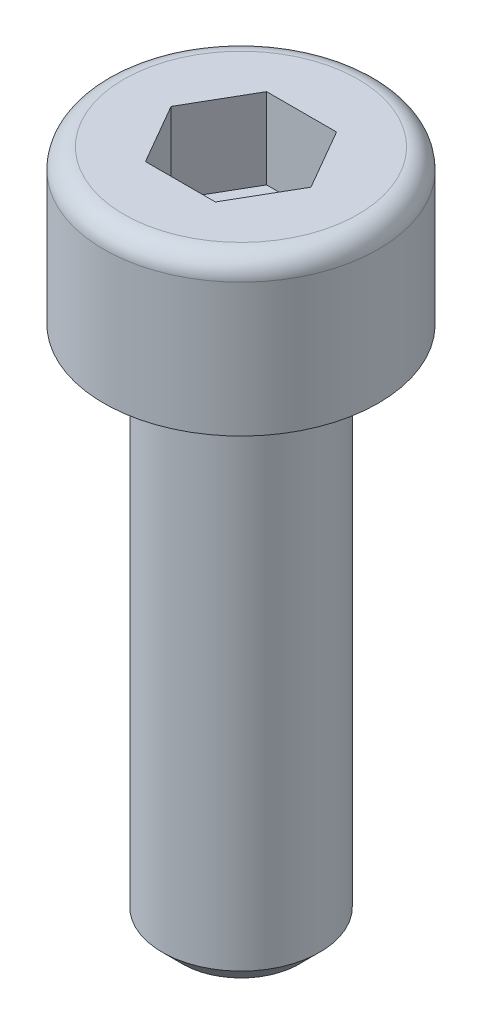
ISO-10303-21;
HEADER;
FILE_DESCRIPTION(('STEP AP214'),'2;1');
FILE_NAME('part.step','',(''),(''),'','','');
FILE_SCHEMA(('AUTOMOTIVE_DESIGN { 1 0 10303 214 1 1 1 1 }'));
ENDSEC;
DATA;
#1=APPLICATION_CONTEXT('core data for automotive mechanical design processes');
#2=APPLICATION_PROTOCOL_DEFINITION('international standard','automotive_design',2000,#1);
#3=PRODUCT_CONTEXT('',#1,'mechanical');
#4=PRODUCT('Part','Part','',(#3));
#5=PRODUCT_RELATED_PRODUCT_CATEGORY('part','',(#4));
#6=PRODUCT_DEFINITION_FORMATION('','',#4);
#7=PRODUCT_DEFINITION_CONTEXT('part definition',#1,'design');
#8=PRODUCT_DEFINITION('design','',#6,#7);
#9=PRODUCT_DEFINITION_SHAPE('','',#8);
#10=(LENGTH_UNIT() NAMED_UNIT(*) SI_UNIT(.MILLI.,.METRE.));
#11=(NAMED_UNIT(*) PLANE_ANGLE_UNIT() SI_UNIT($,.RADIAN.));
#12=(NAMED_UNIT(*) SI_UNIT($,.STERADIAN.) SOLID_ANGLE_UNIT());
#13=UNCERTAINTY_MEASURE_WITH_UNIT(LENGTH_MEASURE(1.E-05),#10,'distance_accuracy_value','');
#14=(GEOMETRIC_REPRESENTATION_CONTEXT(3) GLOBAL_UNCERTAINTY_ASSIGNED_CONTEXT((#13)) GLOBAL_UNIT_ASSIGNED_CONTEXT((#10,
#11,#12)) REPRESENTATION_CONTEXT('',''));
#15=CARTESIAN_POINT('',(0.,0.,0.));
#16=DIRECTION('',(0.,0.,1.));
#17=DIRECTION('',(1.,0.,0.));
#18=AXIS2_PLACEMENT_3D('',#15,#16,#17);
#19=CARTESIAN_POINT('',(0.,3.8,0.));
#20=DIRECTION('',(0.,1.,0.));
#21=DIRECTION('',(-1.,0.,0.));
#22=AXIS2_PLACEMENT_3D('',#19,#20,#21);
#23=PLANE('',#22);
#24=DIRECTION('',(0.5,0.,-0.866025403784439));
#25=VECTOR('',#24,1.);
#26=CARTESIAN_POINT('',(0.866025403784438,3.8,1.5));
#27=LINE('',#26,#25);
#28=CARTESIAN_POINT('',(0.866025403784438,3.8,1.5));
#29=VERTEX_POINT('',#28);
#30=CARTESIAN_POINT('',(1.73205080756888,3.8,0.));
#31=VERTEX_POINT('',#30);
#32=EDGE_CURVE('E44',#29,#31,#27,.T.);
#33=ORIENTED_EDGE('',*,*,#32,.F.);
#34=DIRECTION('',(1.,0.,0.));
#35=VECTOR('',#34,1.);
#36=CARTESIAN_POINT('',(-0.86602540378444,3.8,1.5));
#37=LINE('',#36,#35);
#38=CARTESIAN_POINT('',(-0.86602540378444,3.8,1.5));
#39=VERTEX_POINT('',#38);
#40=EDGE_CURVE('E127',#39,#29,#37,.T.);
#41=ORIENTED_EDGE('',*,*,#40,.F.);
#42=DIRECTION('',(0.5,0.,0.866025403784439));
#43=VECTOR('',#42,1.);
#44=CARTESIAN_POINT('',(-1.73205080756888,3.8,0.));
#45=LINE('',#44,#43);
#46=CARTESIAN_POINT('',(-1.73205080756888,3.8,0.));
#47=VERTEX_POINT('',#46);
#48=EDGE_CURVE('E125',#47,#39,#45,.T.);
#49=ORIENTED_EDGE('',*,*,#48,.F.);
#50=DIRECTION('',(-0.5,0.,0.866025403784439));
#51=VECTOR('',#50,1.);
#52=CARTESIAN_POINT('',(-0.866025403784439,3.8,-1.5));
#53=LINE('',#52,#51);
#54=CARTESIAN_POINT('',(-0.866025403784439,3.8,-1.5));
#55=VERTEX_POINT('',#54);
#56=EDGE_CURVE('E92',#55,#47,#53,.T.);
#57=ORIENTED_EDGE('',*,*,#56,.F.);
#58=DIRECTION('',(-1.,0.,0.));
#59=VECTOR('',#58,1.);
#60=CARTESIAN_POINT('',(0.866025403784439,3.8,-1.5));
#61=LINE('',#60,#59);
#62=CARTESIAN_POINT('',(0.866025403784439,3.8,-1.5));
#63=VERTEX_POINT('',#62);
#64=EDGE_CURVE('E121',#63,#55,#61,.T.);
#65=ORIENTED_EDGE('',*,*,#64,.F.);
#66=DIRECTION('',(-0.5,0.,-0.866025403784439));
#67=VECTOR('',#66,1.);
#68=CARTESIAN_POINT('',(1.73205080756888,3.8,0.));
#69=LINE('',#68,#67);
#70=EDGE_CURVE('E118',#31,#63,#69,.T.);
#71=ORIENTED_EDGE('',*,*,#70,.F.);
#72=EDGE_LOOP('',(#33,#41,#49,#57,#65,#71));
#73=FACE_BOUND('',#72,.T.);
#74=CARTESIAN_POINT('',(0.,3.8,0.));
#75=DIRECTION('',(0.,1.,0.));
#76=DIRECTION('',(-1.,0.,0.));
#77=AXIS2_PLACEMENT_3D('',#74,#75,#76);
#78=CIRCLE('',#77,2.9);
#79=CARTESIAN_POINT('',(-2.9,3.8,0.));
#80=VERTEX_POINT('',#79);
#81=EDGE_CURVE('E11',#80,#80,#78,.T.);
#82=ORIENTED_EDGE('',*,*,#81,.T.);
#83=EDGE_LOOP('',(#82));
#84=FACE_BOUND('',#83,.T.);
#85=ADVANCED_FACE('F30',(#73,#84),#23,.T.);
#86=CARTESIAN_POINT('',(0.,3.3,0.));
#87=DIRECTION('',(0.,1.,0.));
#88=DIRECTION('',(-1.,0.,0.));
#89=AXIS2_PLACEMENT_3D('',#86,#87,#88);
#90=TOROIDAL_SURFACE('',#89,2.9,0.5);
#91=CARTESIAN_POINT('',(0.,3.3,0.));
#92=DIRECTION('',(0.,1.,0.));
#93=DIRECTION('',(-1.,0.,0.));
#94=AXIS2_PLACEMENT_3D('',#91,#92,#93);
#95=CIRCLE('',#94,3.4);
#96=CARTESIAN_POINT('',(-3.4,3.3,0.));
#97=VERTEX_POINT('',#96);
#98=EDGE_CURVE('E37',#97,#97,#95,.T.);
#99=ORIENTED_EDGE('',*,*,#98,.T.);
#100=EDGE_LOOP('',(#99));
#101=FACE_BOUND('',#100,.T.);
#102=ORIENTED_EDGE('',*,*,#81,.F.);
#103=EDGE_LOOP('',(#102));
#104=FACE_BOUND('',#103,.T.);
#105=ADVANCED_FACE('F150',(#101,#104),#90,.T.);
#106=CARTESIAN_POINT('',(0.,3.8,0.));
#107=DIRECTION('',(0.,1.,0.));
#108=DIRECTION('',(-1.,0.,0.));
#109=AXIS2_PLACEMENT_3D('',#106,#107,#108);
#110=CYLINDRICAL_SURFACE('',#109,3.4);
#111=CARTESIAN_POINT('',(0.,0.,0.));
#112=DIRECTION('',(0.,1.,0.));
#113=DIRECTION('',(-1.,0.,0.));
#114=AXIS2_PLACEMENT_3D('',#111,#112,#113);
#115=CIRCLE('',#114,3.4);
#116=CARTESIAN_POINT('',(-3.4,0.,0.));
#117=VERTEX_POINT('',#116);
#118=EDGE_CURVE('E145',#117,#117,#115,.T.);
#119=ORIENTED_EDGE('',*,*,#118,.T.);
#120=EDGE_LOOP('',(#119));
#121=FACE_BOUND('',#120,.T.);
#122=ORIENTED_EDGE('',*,*,#98,.F.);
#123=EDGE_LOOP('',(#122));
#124=FACE_BOUND('',#123,.T.);
#125=ADVANCED_FACE('F153',(#121,#124),#110,.T.);
#126=CARTESIAN_POINT('',(-3.4,0.,0.));
#127=DIRECTION('',(0.,-1.,0.));
#128=DIRECTION('',(1.,0.,0.));
#129=AXIS2_PLACEMENT_3D('',#126,#127,#128);
#130=PLANE('',#129);
#131=CARTESIAN_POINT('',(0.,0.,0.));
#132=DIRECTION('',(0.,1.,0.));
#133=DIRECTION('',(-1.,0.,0.));
#134=AXIS2_PLACEMENT_3D('',#131,#132,#133);
#135=CIRCLE('',#134,1.95);
#136=CARTESIAN_POINT('',(-1.95,0.,0.));
#137=VERTEX_POINT('',#136);
#138=EDGE_CURVE('E142',#137,#137,#135,.T.);
#139=ORIENTED_EDGE('',*,*,#138,.T.);
#140=EDGE_LOOP('',(#139));
#141=FACE_BOUND('',#140,.T.);
#142=ORIENTED_EDGE('',*,*,#118,.F.);
#143=EDGE_LOOP('',(#142));
#144=FACE_BOUND('',#143,.T.);
#145=ADVANCED_FACE('F155',(#141,#144),#130,.T.);
#146=CARTESIAN_POINT('',(0.,3.8,0.));
#147=DIRECTION('',(0.,1.,0.));
#148=DIRECTION('',(-1.,0.,0.));
#149=AXIS2_PLACEMENT_3D('',#146,#147,#148);
#150=CYLINDRICAL_SURFACE('',#149,1.95);
#151=CARTESIAN_POINT('',(0.,-12.5,0.));
#152=DIRECTION('',(0.,1.,0.));
#153=DIRECTION('',(-1.,0.,0.));
#154=AXIS2_PLACEMENT_3D('',#151,#152,#153);
#155=CIRCLE('',#154,1.95);
#156=CARTESIAN_POINT('',(-1.95,-12.5,0.));
#157=VERTEX_POINT('',#156);
#158=EDGE_CURVE('E139',#157,#157,#155,.T.);
#159=ORIENTED_EDGE('',*,*,#158,.T.);
#160=EDGE_LOOP('',(#159));
#161=FACE_BOUND('',#160,.T.);
#162=ORIENTED_EDGE('',*,*,#138,.F.);
#163=EDGE_LOOP('',(#162));
#164=FACE_BOUND('',#163,.T.);
#165=ADVANCED_FACE('F162',(#161,#164),#150,.T.);
#166=CARTESIAN_POINT('',(0.,-12.5,0.));
#167=DIRECTION('',(0.,1.,0.));
#168=DIRECTION('',(-1.,0.,0.));
#169=AXIS2_PLACEMENT_3D('',#166,#167,#168);
#170=CONICAL_SURFACE('',#169,1.95,0.785398163397448);
#171=CARTESIAN_POINT('',(0.,-13.,0.));
#172=DIRECTION('',(0.,1.,0.));
#173=DIRECTION('',(-1.,0.,0.));
#174=AXIS2_PLACEMENT_3D('',#171,#172,#173);
#175=CIRCLE('',#174,1.45);
#176=CARTESIAN_POINT('',(-1.45,-13.,0.));
#177=VERTEX_POINT('',#176);
#178=EDGE_CURVE('E131',#177,#177,#175,.T.);
#179=ORIENTED_EDGE('',*,*,#178,.T.);
#180=EDGE_LOOP('',(#179));
#181=FACE_BOUND('',#180,.T.);
#182=ORIENTED_EDGE('',*,*,#158,.F.);
#183=EDGE_LOOP('',(#182));
#184=FACE_BOUND('',#183,.T.);
#185=ADVANCED_FACE('F187',(#181,#184),#170,.T.);
#186=CARTESIAN_POINT('',(-1.45,-13.,0.));
#187=DIRECTION('',(0.,-1.,0.));
#188=DIRECTION('',(1.,0.,0.));
#189=AXIS2_PLACEMENT_3D('',#186,#187,#188);
#190=PLANE('',#189);
#191=ORIENTED_EDGE('',*,*,#178,.F.);
#192=EDGE_LOOP('',(#191));
#193=FACE_BOUND('',#192,.T.);
#194=ADVANCED_FACE('F180',(#193),#190,.T.);
#195=CARTESIAN_POINT('',(0.866025403784438,1.8,1.5));
#196=DIRECTION('',(0.866025403784439,0.,0.5));
#197=DIRECTION('',(0.5,0.,-0.866025403784439));
#198=AXIS2_PLACEMENT_3D('',#195,#196,#197);
#199=PLANE('',#198);
#200=ORIENTED_EDGE('',*,*,#32,.T.);
#201=DIRECTION('',(0.,1.,0.));
#202=VECTOR('',#201,1.);
#203=CARTESIAN_POINT('',(1.73205080756888,1.8,0.));
#204=LINE('',#203,#202);
#205=CARTESIAN_POINT('',(1.73205080756888,1.8,0.));
#206=VERTEX_POINT('',#205);
#207=EDGE_CURVE('E74',#206,#31,#204,.T.);
#208=ORIENTED_EDGE('',*,*,#207,.F.);
#209=DIRECTION('',(0.5,0.,-0.866025403784439));
#210=VECTOR('',#209,1.);
#211=CARTESIAN_POINT('',(0.866025403784438,1.8,1.5));
#212=LINE('',#211,#210);
#213=CARTESIAN_POINT('',(0.866025403784438,1.8,1.5));
#214=VERTEX_POINT('',#213);
#215=EDGE_CURVE('E129',#214,#206,#212,.T.);
#216=ORIENTED_EDGE('',*,*,#215,.F.);
#217=DIRECTION('',(0.,1.,0.));
#218=VECTOR('',#217,1.);
#219=CARTESIAN_POINT('',(0.866025403784438,1.8,1.5));
#220=LINE('',#219,#218);
#221=EDGE_CURVE('E52',#214,#29,#220,.T.);
#222=ORIENTED_EDGE('',*,*,#221,.T.);
#223=EDGE_LOOP('',(#200,#208,#216,#222));
#224=FACE_BOUND('',#223,.T.);
#225=ADVANCED_FACE('F177',(#224),#199,.F.);
#226=CARTESIAN_POINT('',(-0.86602540378444,1.8,1.5));
#227=DIRECTION('',(0.,0.,1.));
#228=DIRECTION('',(1.,0.,0.));
#229=AXIS2_PLACEMENT_3D('',#226,#227,#228);
#230=PLANE('',#229);
#231=ORIENTED_EDGE('',*,*,#40,.T.);
#232=ORIENTED_EDGE('',*,*,#221,.F.);
#233=DIRECTION('',(1.,0.,0.));
#234=VECTOR('',#233,1.);
#235=CARTESIAN_POINT('',(-0.86602540378444,1.8,1.5));
#236=LINE('',#235,#234);
#237=CARTESIAN_POINT('',(-0.86602540378444,1.8,1.5));
#238=VERTEX_POINT('',#237);
#239=EDGE_CURVE('E104',#238,#214,#236,.T.);
#240=ORIENTED_EDGE('',*,*,#239,.F.);
#241=DIRECTION('',(0.,1.,0.));
#242=VECTOR('',#241,1.);
#243=CARTESIAN_POINT('',(-0.86602540378444,1.8,1.5));
#244=LINE('',#243,#242);
#245=EDGE_CURVE('E96',#238,#39,#244,.T.);
#246=ORIENTED_EDGE('',*,*,#245,.T.);
#247=EDGE_LOOP('',(#231,#232,#240,#246));
#248=FACE_BOUND('',#247,.T.);
#249=ADVANCED_FACE('F179',(#248),#230,.F.);
#250=CARTESIAN_POINT('',(-1.73205080756888,1.8,0.));
#251=DIRECTION('',(-0.866025403784439,0.,0.5));
#252=DIRECTION('',(0.5,0.,0.866025403784439));
#253=AXIS2_PLACEMENT_3D('',#250,#251,#252);
#254=PLANE('',#253);
#255=ORIENTED_EDGE('',*,*,#48,.T.);
#256=ORIENTED_EDGE('',*,*,#245,.F.);
#257=DIRECTION('',(0.5,0.,0.866025403784439));
#258=VECTOR('',#257,1.);
#259=CARTESIAN_POINT('',(-1.73205080756888,1.8,0.));
#260=LINE('',#259,#258);
#261=CARTESIAN_POINT('',(-1.73205080756888,1.8,0.));
#262=VERTEX_POINT('',#261);
#263=EDGE_CURVE('E100',#262,#238,#260,.T.);
#264=ORIENTED_EDGE('',*,*,#263,.F.);
#265=DIRECTION('',(0.,1.,0.));
#266=VECTOR('',#265,1.);
#267=CARTESIAN_POINT('',(-1.73205080756888,1.8,0.));
#268=LINE('',#267,#266);
#269=EDGE_CURVE('E85',#262,#47,#268,.T.);
#270=ORIENTED_EDGE('',*,*,#269,.T.);
#271=EDGE_LOOP('',(#255,#256,#264,#270));
#272=FACE_BOUND('',#271,.T.);
#273=ADVANCED_FACE('F101',(#272),#254,.F.);
#274=CARTESIAN_POINT('',(-0.866025403784438,1.8,-1.5));
#275=DIRECTION('',(-0.866025403784439,0.,-0.5));
#276=DIRECTION('',(-0.5,0.,0.866025403784439));
#277=AXIS2_PLACEMENT_3D('',#274,#275,#276);
#278=PLANE('',#277);
#279=ORIENTED_EDGE('',*,*,#56,.T.);
#280=ORIENTED_EDGE('',*,*,#269,.F.);
#281=DIRECTION('',(-0.5,0.,0.866025403784439));
#282=VECTOR('',#281,1.);
#283=CARTESIAN_POINT('',(-0.866025403784438,1.8,-1.5));
#284=LINE('',#283,#282);
#285=CARTESIAN_POINT('',(-0.866025403784438,1.8,-1.5));
#286=VERTEX_POINT('',#285);
#287=EDGE_CURVE('E89',#286,#262,#284,.T.);
#288=ORIENTED_EDGE('',*,*,#287,.F.);
#289=DIRECTION('',(0.,1.,0.));
#290=VECTOR('',#289,1.);
#291=CARTESIAN_POINT('',(-0.866025403784438,1.8,-1.5));
#292=LINE('',#291,#290);
#293=EDGE_CURVE('E97',#286,#55,#292,.T.);
#294=ORIENTED_EDGE('',*,*,#293,.T.);
#295=EDGE_LOOP('',(#279,#280,#288,#294));
#296=FACE_BOUND('',#295,.T.);
#297=ADVANCED_FACE('F87',(#296),#278,.F.);
#298=CARTESIAN_POINT('',(0.866025403784439,1.8,-1.5));
#299=DIRECTION('',(0.,0.,-1.));
#300=DIRECTION('',(-1.,0.,0.));
#301=AXIS2_PLACEMENT_3D('',#298,#299,#300);
#302=PLANE('',#301);
#303=ORIENTED_EDGE('',*,*,#64,.T.);
#304=ORIENTED_EDGE('',*,*,#293,.F.);
#305=DIRECTION('',(-1.,0.,0.));
#306=VECTOR('',#305,1.);
#307=CARTESIAN_POINT('',(0.866025403784439,1.8,-1.5));
#308=LINE('',#307,#306);
#309=CARTESIAN_POINT('',(0.866025403784439,1.8,-1.5));
#310=VERTEX_POINT('',#309);
#311=EDGE_CURVE('E110',#310,#286,#308,.T.);
#312=ORIENTED_EDGE('',*,*,#311,.F.);
#313=DIRECTION('',(0.,1.,0.));
#314=VECTOR('',#313,1.);
#315=CARTESIAN_POINT('',(0.866025403784439,1.8,-1.5));
#316=LINE('',#315,#314);
#317=EDGE_CURVE('E134',#310,#63,#316,.T.);
#318=ORIENTED_EDGE('',*,*,#317,.T.);
#319=EDGE_LOOP('',(#303,#304,#312,#318));
#320=FACE_BOUND('',#319,.T.);
#321=ADVANCED_FACE('F248',(#320),#302,.F.);
#322=CARTESIAN_POINT('',(1.73205080756888,1.8,0.));
#323=DIRECTION('',(0.866025403784439,0.,-0.5));
#324=DIRECTION('',(-0.5,0.,-0.866025403784439));
#325=AXIS2_PLACEMENT_3D('',#322,#323,#324);
#326=PLANE('',#325);
#327=ORIENTED_EDGE('',*,*,#70,.T.);
#328=ORIENTED_EDGE('',*,*,#317,.F.);
#329=DIRECTION('',(-0.5,0.,-0.866025403784439));
#330=VECTOR('',#329,1.);
#331=CARTESIAN_POINT('',(1.73205080756888,1.8,0.));
#332=LINE('',#331,#330);
#333=EDGE_CURVE('E112',#206,#310,#332,.T.);
#334=ORIENTED_EDGE('',*,*,#333,.F.);
#335=ORIENTED_EDGE('',*,*,#207,.T.);
#336=EDGE_LOOP('',(#327,#328,#334,#335));
#337=FACE_BOUND('',#336,.T.);
#338=ADVANCED_FACE('F175',(#337),#326,.F.);
#339=CARTESIAN_POINT('',(2.59807621135332,1.8,-1.5));
#340=DIRECTION('',(0.,1.,0.));
#341=DIRECTION('',(0.,0.,1.));
#342=AXIS2_PLACEMENT_3D('',#339,#340,#341);
#343=PLANE('',#342);
#344=ORIENTED_EDGE('',*,*,#215,.T.);
#345=ORIENTED_EDGE('',*,*,#333,.T.);
#346=ORIENTED_EDGE('',*,*,#311,.T.);
#347=ORIENTED_EDGE('',*,*,#287,.T.);
#348=ORIENTED_EDGE('',*,*,#263,.T.);
#349=ORIENTED_EDGE('',*,*,#239,.T.);
#350=EDGE_LOOP('',(#344,#345,#346,#347,#348,#349));
#351=FACE_BOUND('',#350,.T.);
#352=ADVANCED_FACE('F107',(#351),#343,.T.);
#353=CLOSED_SHELL('',(#85,#105,#125,#145,#165,#185,#194,#225,#249,#273,#297,#321,#338,#352));
#354=MANIFOLD_SOLID_BREP('B2',#353);
#355=ADVANCED_BREP_SHAPE_REPRESENTATION('',(#18,#354),#14);
#356=SHAPE_DEFINITION_REPRESENTATION(#9,#355);
ENDSEC;
END-ISO-10303-21;
